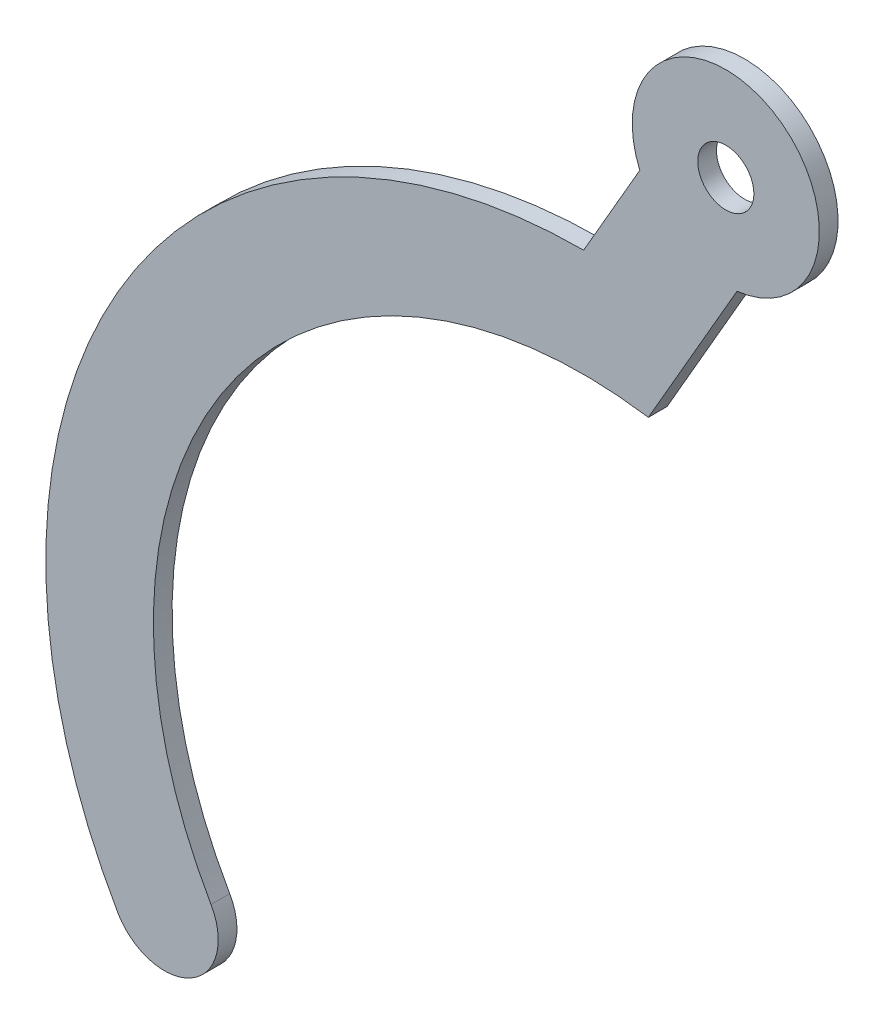
ISO-10303-21;
HEADER;
FILE_DESCRIPTION(('STEP AP214'),'2;1');
FILE_NAME('part.step','',(''),(''),'','','');
FILE_SCHEMA(('AUTOMOTIVE_DESIGN { 1 0 10303 214 1 1 1 1 }'));
ENDSEC;
DATA;
#1=APPLICATION_CONTEXT('core data for automotive mechanical design processes');
#2=APPLICATION_PROTOCOL_DEFINITION('international standard','automotive_design',2000,#1);
#3=PRODUCT_CONTEXT('',#1,'mechanical');
#4=PRODUCT('Part','Part','',(#3));
#5=PRODUCT_RELATED_PRODUCT_CATEGORY('part','',(#4));
#6=PRODUCT_DEFINITION_FORMATION('','',#4);
#7=PRODUCT_DEFINITION_CONTEXT('part definition',#1,'design');
#8=PRODUCT_DEFINITION('design','',#6,#7);
#9=PRODUCT_DEFINITION_SHAPE('','',#8);
#10=(LENGTH_UNIT() NAMED_UNIT(*) SI_UNIT(.MILLI.,.METRE.));
#11=(NAMED_UNIT(*) PLANE_ANGLE_UNIT() SI_UNIT($,.RADIAN.));
#12=(NAMED_UNIT(*) SI_UNIT($,.STERADIAN.) SOLID_ANGLE_UNIT());
#13=UNCERTAINTY_MEASURE_WITH_UNIT(LENGTH_MEASURE(1.E-05),#10,'distance_accuracy_value','');
#14=(GEOMETRIC_REPRESENTATION_CONTEXT(3) GLOBAL_UNCERTAINTY_ASSIGNED_CONTEXT((#13)) GLOBAL_UNIT_ASSIGNED_CONTEXT((#10,
#11,#12)) REPRESENTATION_CONTEXT('',''));
#15=CARTESIAN_POINT('',(0.,0.,0.));
#16=DIRECTION('',(0.,0.,1.));
#17=DIRECTION('',(1.,0.,0.));
#18=AXIS2_PLACEMENT_3D('',#15,#16,#17);
#19=CARTESIAN_POINT('',(0.,0.,2.));
#20=DIRECTION('',(0.,0.,1.));
#21=DIRECTION('',(1.,0.,0.));
#22=AXIS2_PLACEMENT_3D('',#19,#20,#21);
#23=PLANE('',#22);
#24=CARTESIAN_POINT('',(0.,0.,2.));
#25=DIRECTION('',(0.,0.,1.));
#26=DIRECTION('',(1.,0.,0.));
#27=AXIS2_PLACEMENT_3D('',#24,#25,#26);
#28=CIRCLE('',#27,57.5);
#29=CARTESIAN_POINT('',(0.,57.5,2.));
#30=VERTEX_POINT('',#29);
#31=CARTESIAN_POINT('',(-49.7964607176054,-28.7499999999997,2.));
#32=VERTEX_POINT('',#31);
#33=EDGE_CURVE('E146',#30,#32,#28,.T.);
#34=ORIENTED_EDGE('',*,*,#33,.T.);
#35=CARTESIAN_POINT('',(-44.8168146458447,-25.875,2.));
#36=DIRECTION('',(0.,0.,1.));
#37=DIRECTION('',(1.,0.,0.));
#38=AXIS2_PLACEMENT_3D('',#35,#36,#37);
#39=CIRCLE('',#38,5.75);
#40=CARTESIAN_POINT('',(-39.8371685740843,-22.9999999999998,2.));
#41=VERTEX_POINT('',#40);
#42=EDGE_CURVE('E94',#32,#41,#39,.T.);
#43=ORIENTED_EDGE('',*,*,#42,.T.);
#44=CARTESIAN_POINT('',(0.,0.,2.));
#45=DIRECTION('',(0.,0.,-1.));
#46=DIRECTION('',(1.,0.,0.));
#47=AXIS2_PLACEMENT_3D('',#44,#45,#46);
#48=CIRCLE('',#47,46.);
#49=CARTESIAN_POINT('',(6.91507761438228,45.4772657663922,2.));
#50=VERTEX_POINT('',#49);
#51=EDGE_CURVE('E107',#41,#50,#48,.T.);
#52=ORIENTED_EDGE('',*,*,#51,.T.);
#53=DIRECTION('',(0.499999999999999,0.866025403784439,0.));
#54=VECTOR('',#53,1.);
#55=CARTESIAN_POINT('',(16.3923048454133,61.8923048454133,2.));
#56=LINE('',#55,#54);
#57=CARTESIAN_POINT('',(16.3923048454133,61.8923048454133,2.));
#58=VERTEX_POINT('',#57);
#59=EDGE_CURVE('E101',#50,#58,#56,.T.);
#60=ORIENTED_EDGE('',*,*,#59,.T.);
#61=CARTESIAN_POINT('',(15.1961524227066,71.8205080756888,2.));
#62=DIRECTION('',(0.,0.,1.));
#63=DIRECTION('',(1.,0.,0.));
#64=AXIS2_PLACEMENT_3D('',#61,#62,#63);
#65=CIRCLE('',#64,10.);
#66=CARTESIAN_POINT('',(6.,67.8923048454133,2.));
#67=VERTEX_POINT('',#66);
#68=EDGE_CURVE('E105',#58,#67,#65,.T.);
#69=ORIENTED_EDGE('',*,*,#68,.T.);
#70=DIRECTION('',(-0.5,-0.866025403784439,0.));
#71=VECTOR('',#70,1.);
#72=CARTESIAN_POINT('',(0.,57.5,2.));
#73=LINE('',#72,#71);
#74=EDGE_CURVE('E57',#67,#30,#73,.T.);
#75=ORIENTED_EDGE('',*,*,#74,.T.);
#76=EDGE_LOOP('',(#34,#43,#52,#60,#69,#75));
#77=FACE_BOUND('',#76,.T.);
#78=CARTESIAN_POINT('',(15.1961524227066,71.8205080756888,2.));
#79=DIRECTION('',(0.,0.,1.));
#80=DIRECTION('',(1.,0.,0.));
#81=AXIS2_PLACEMENT_3D('',#78,#79,#80);
#82=CIRCLE('',#81,3.);
#83=CARTESIAN_POINT('',(18.1961524227066,71.8205080756888,2.));
#84=VERTEX_POINT('',#83);
#85=EDGE_CURVE('E134',#84,#84,#82,.T.);
#86=ORIENTED_EDGE('',*,*,#85,.F.);
#87=EDGE_LOOP('',(#86));
#88=FACE_BOUND('',#87,.T.);
#89=ADVANCED_FACE('F39',(#77,#88),#23,.T.);
#90=CARTESIAN_POINT('',(0.,0.,0.));
#91=DIRECTION('',(0.,0.,1.));
#92=DIRECTION('',(1.,0.,0.));
#93=AXIS2_PLACEMENT_3D('',#90,#91,#92);
#94=PLANE('',#93);
#95=CARTESIAN_POINT('',(0.,0.,0.));
#96=DIRECTION('',(0.,0.,1.));
#97=DIRECTION('',(1.,0.,0.));
#98=AXIS2_PLACEMENT_3D('',#95,#96,#97);
#99=CIRCLE('',#98,57.5);
#100=CARTESIAN_POINT('',(0.,57.5,0.));
#101=VERTEX_POINT('',#100);
#102=CARTESIAN_POINT('',(-49.7964607176054,-28.7499999999997,0.));
#103=VERTEX_POINT('',#102);
#104=EDGE_CURVE('E129',#101,#103,#99,.T.);
#105=ORIENTED_EDGE('',*,*,#104,.F.);
#106=DIRECTION('',(-0.5,-0.866025403784439,0.));
#107=VECTOR('',#106,1.);
#108=CARTESIAN_POINT('',(0.,57.5,0.));
#109=LINE('',#108,#107);
#110=CARTESIAN_POINT('',(6.,67.8923048454133,0.));
#111=VERTEX_POINT('',#110);
#112=EDGE_CURVE('E86',#111,#101,#109,.T.);
#113=ORIENTED_EDGE('',*,*,#112,.F.);
#114=CARTESIAN_POINT('',(15.1961524227066,71.8205080756888,0.));
#115=DIRECTION('',(0.,0.,1.));
#116=DIRECTION('',(1.,0.,0.));
#117=AXIS2_PLACEMENT_3D('',#114,#115,#116);
#118=CIRCLE('',#117,10.);
#119=CARTESIAN_POINT('',(16.3923048454133,61.8923048454133,0.));
#120=VERTEX_POINT('',#119);
#121=EDGE_CURVE('E80',#120,#111,#118,.T.);
#122=ORIENTED_EDGE('',*,*,#121,.F.);
#123=DIRECTION('',(0.499999999999999,0.866025403784439,0.));
#124=VECTOR('',#123,1.);
#125=CARTESIAN_POINT('',(16.3923048454133,61.8923048454133,0.));
#126=LINE('',#125,#124);
#127=CARTESIAN_POINT('',(6.91507761438228,45.4772657663922,0.));
#128=VERTEX_POINT('',#127);
#129=EDGE_CURVE('E116',#128,#120,#126,.T.);
#130=ORIENTED_EDGE('',*,*,#129,.F.);
#131=CARTESIAN_POINT('',(0.,0.,0.));
#132=DIRECTION('',(0.,0.,-1.));
#133=DIRECTION('',(1.,0.,0.));
#134=AXIS2_PLACEMENT_3D('',#131,#132,#133);
#135=CIRCLE('',#134,46.);
#136=CARTESIAN_POINT('',(-39.8371685740843,-22.9999999999998,0.));
#137=VERTEX_POINT('',#136);
#138=EDGE_CURVE('E137',#137,#128,#135,.T.);
#139=ORIENTED_EDGE('',*,*,#138,.F.);
#140=CARTESIAN_POINT('',(-44.8168146458447,-25.875,0.));
#141=DIRECTION('',(0.,0.,1.));
#142=DIRECTION('',(1.,0.,0.));
#143=AXIS2_PLACEMENT_3D('',#140,#141,#142);
#144=CIRCLE('',#143,5.75);
#145=EDGE_CURVE('E133',#103,#137,#144,.T.);
#146=ORIENTED_EDGE('',*,*,#145,.F.);
#147=EDGE_LOOP('',(#105,#113,#122,#130,#139,#146));
#148=FACE_BOUND('',#147,.T.);
#149=CARTESIAN_POINT('',(15.1961524227066,71.8205080756888,0.));
#150=DIRECTION('',(0.,0.,1.));
#151=DIRECTION('',(1.,0.,0.));
#152=AXIS2_PLACEMENT_3D('',#149,#150,#151);
#153=CIRCLE('',#152,3.);
#154=CARTESIAN_POINT('',(18.1961524227066,71.8205080756888,0.));
#155=VERTEX_POINT('',#154);
#156=EDGE_CURVE('E243',#155,#155,#153,.T.);
#157=ORIENTED_EDGE('',*,*,#156,.T.);
#158=EDGE_LOOP('',(#157));
#159=FACE_BOUND('',#158,.T.);
#160=ADVANCED_FACE('F159',(#148,#159),#94,.F.);
#161=CARTESIAN_POINT('',(0.,0.,2.));
#162=DIRECTION('',(0.,0.,-1.));
#163=DIRECTION('',(-1.,0.,0.));
#164=AXIS2_PLACEMENT_3D('',#161,#162,#163);
#165=CYLINDRICAL_SURFACE('',#164,57.5);
#166=ORIENTED_EDGE('',*,*,#104,.T.);
#167=DIRECTION('',(0.,0.,-1.));
#168=VECTOR('',#167,1.);
#169=CARTESIAN_POINT('',(-49.7964607176054,-28.7499999999997,2.));
#170=LINE('',#169,#168);
#171=EDGE_CURVE('E11',#32,#103,#170,.T.);
#172=ORIENTED_EDGE('',*,*,#171,.F.);
#173=ORIENTED_EDGE('',*,*,#33,.F.);
#174=DIRECTION('',(0.,0.,-1.));
#175=VECTOR('',#174,1.);
#176=CARTESIAN_POINT('',(0.,57.5,2.));
#177=LINE('',#176,#175);
#178=EDGE_CURVE('E125',#30,#101,#177,.T.);
#179=ORIENTED_EDGE('',*,*,#178,.T.);
#180=EDGE_LOOP('',(#166,#172,#173,#179));
#181=FACE_BOUND('',#180,.T.);
#182=ADVANCED_FACE('F41',(#181),#165,.T.);
#183=CARTESIAN_POINT('',(-44.8168146458447,-25.875,2.));
#184=DIRECTION('',(0.,0.,-1.));
#185=DIRECTION('',(-1.,0.,0.));
#186=AXIS2_PLACEMENT_3D('',#183,#184,#185);
#187=CYLINDRICAL_SURFACE('',#186,5.75);
#188=ORIENTED_EDGE('',*,*,#145,.T.);
#189=DIRECTION('',(0.,0.,-1.));
#190=VECTOR('',#189,1.);
#191=CARTESIAN_POINT('',(-39.8371685740843,-22.9999999999998,2.));
#192=LINE('',#191,#190);
#193=EDGE_CURVE('E49',#41,#137,#192,.T.);
#194=ORIENTED_EDGE('',*,*,#193,.F.);
#195=ORIENTED_EDGE('',*,*,#42,.F.);
#196=ORIENTED_EDGE('',*,*,#171,.T.);
#197=EDGE_LOOP('',(#188,#194,#195,#196));
#198=FACE_BOUND('',#197,.T.);
#199=ADVANCED_FACE('F184',(#198),#187,.T.);
#200=CARTESIAN_POINT('',(0.,0.,2.));
#201=DIRECTION('',(0.,0.,-1.));
#202=DIRECTION('',(-1.,0.,0.));
#203=AXIS2_PLACEMENT_3D('',#200,#201,#202);
#204=CYLINDRICAL_SURFACE('',#203,46.);
#205=ORIENTED_EDGE('',*,*,#138,.T.);
#206=DIRECTION('',(0.,0.,-1.));
#207=VECTOR('',#206,1.);
#208=CARTESIAN_POINT('',(6.91507761438228,45.4772657663922,2.));
#209=LINE('',#208,#207);
#210=EDGE_CURVE('E118',#50,#128,#209,.T.);
#211=ORIENTED_EDGE('',*,*,#210,.F.);
#212=ORIENTED_EDGE('',*,*,#51,.F.);
#213=ORIENTED_EDGE('',*,*,#193,.T.);
#214=EDGE_LOOP('',(#205,#211,#212,#213));
#215=FACE_BOUND('',#214,.T.);
#216=ADVANCED_FACE('F156',(#215),#204,.F.);
#217=CARTESIAN_POINT('',(16.3923048454133,61.8923048454133,2.));
#218=DIRECTION('',(-0.866025403784439,0.499999999999999,0.));
#219=DIRECTION('',(-0.499999999999999,-0.866025403784439,0.));
#220=AXIS2_PLACEMENT_3D('',#217,#218,#219);
#221=PLANE('',#220);
#222=ORIENTED_EDGE('',*,*,#129,.T.);
#223=DIRECTION('',(0.,0.,-1.));
#224=VECTOR('',#223,1.);
#225=CARTESIAN_POINT('',(16.3923048454133,61.8923048454133,2.));
#226=LINE('',#225,#224);
#227=EDGE_CURVE('E113',#58,#120,#226,.T.);
#228=ORIENTED_EDGE('',*,*,#227,.F.);
#229=ORIENTED_EDGE('',*,*,#59,.F.);
#230=ORIENTED_EDGE('',*,*,#210,.T.);
#231=EDGE_LOOP('',(#222,#228,#229,#230));
#232=FACE_BOUND('',#231,.T.);
#233=ADVANCED_FACE('F114',(#232),#221,.F.);
#234=CARTESIAN_POINT('',(15.1961524227066,71.8205080756888,2.));
#235=DIRECTION('',(0.,0.,-1.));
#236=DIRECTION('',(-1.,0.,0.));
#237=AXIS2_PLACEMENT_3D('',#234,#235,#236);
#238=CYLINDRICAL_SURFACE('',#237,10.);
#239=ORIENTED_EDGE('',*,*,#121,.T.);
#240=DIRECTION('',(0.,0.,-1.));
#241=VECTOR('',#240,1.);
#242=CARTESIAN_POINT('',(6.,67.8923048454133,2.));
#243=LINE('',#242,#241);
#244=EDGE_CURVE('E119',#67,#111,#243,.T.);
#245=ORIENTED_EDGE('',*,*,#244,.F.);
#246=ORIENTED_EDGE('',*,*,#68,.F.);
#247=ORIENTED_EDGE('',*,*,#227,.T.);
#248=EDGE_LOOP('',(#239,#245,#246,#247));
#249=FACE_BOUND('',#248,.T.);
#250=ADVANCED_FACE('F121',(#249),#238,.T.);
#251=CARTESIAN_POINT('',(0.,57.5,2.));
#252=DIRECTION('',(0.866025403784439,-0.5,0.));
#253=DIRECTION('',(0.5,0.866025403784439,0.));
#254=AXIS2_PLACEMENT_3D('',#251,#252,#253);
#255=PLANE('',#254);
#256=ORIENTED_EDGE('',*,*,#112,.T.);
#257=ORIENTED_EDGE('',*,*,#178,.F.);
#258=ORIENTED_EDGE('',*,*,#74,.F.);
#259=ORIENTED_EDGE('',*,*,#244,.T.);
#260=EDGE_LOOP('',(#256,#257,#258,#259));
#261=FACE_BOUND('',#260,.T.);
#262=ADVANCED_FACE('F164',(#261),#255,.F.);
#263=CARTESIAN_POINT('',(15.1961524227066,71.8205080756888,2.));
#264=DIRECTION('',(0.,0.,-1.));
#265=DIRECTION('',(-1.,0.,0.));
#266=AXIS2_PLACEMENT_3D('',#263,#264,#265);
#267=CYLINDRICAL_SURFACE('',#266,3.);
#268=ORIENTED_EDGE('',*,*,#85,.T.);
#269=EDGE_LOOP('',(#268));
#270=FACE_BOUND('',#269,.T.);
#271=ORIENTED_EDGE('',*,*,#156,.F.);
#272=EDGE_LOOP('',(#271));
#273=FACE_BOUND('',#272,.T.);
#274=ADVANCED_FACE('F166',(#270,#273),#267,.F.);
#275=CLOSED_SHELL('',(#89,#160,#182,#199,#216,#233,#250,#262,#274));
#276=MANIFOLD_SOLID_BREP('B2',#275);
#277=ADVANCED_BREP_SHAPE_REPRESENTATION('',(#18,#276),#14);
#278=SHAPE_DEFINITION_REPRESENTATION(#9,#277);
ENDSEC;
END-ISO-10303-21;
